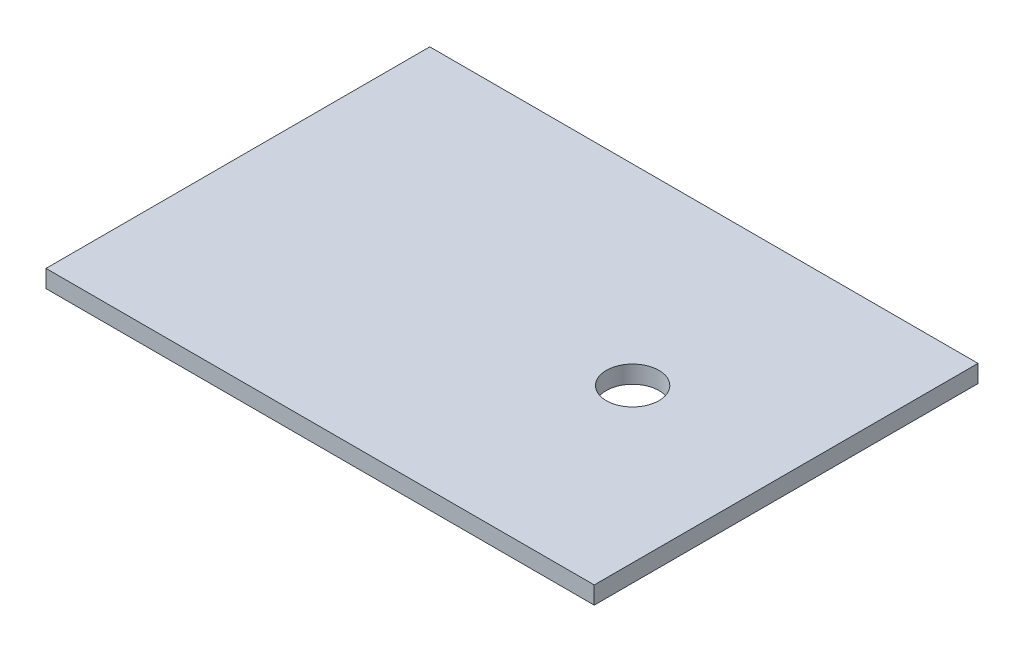
ISO-10303-21;
HEADER;
FILE_DESCRIPTION(('STEP AP214'),'2;1');
FILE_NAME('part.step','',(''),(''),'','','');
FILE_SCHEMA(('AUTOMOTIVE_DESIGN { 1 0 10303 214 1 1 1 1 }'));
ENDSEC;
DATA;
#1=APPLICATION_CONTEXT('core data for automotive mechanical design processes');
#2=APPLICATION_PROTOCOL_DEFINITION('international standard','automotive_design',2000,#1);
#3=PRODUCT_CONTEXT('',#1,'mechanical');
#4=PRODUCT('Part','Part','',(#3));
#5=PRODUCT_RELATED_PRODUCT_CATEGORY('part','',(#4));
#6=PRODUCT_DEFINITION_FORMATION('','',#4);
#7=PRODUCT_DEFINITION_CONTEXT('part definition',#1,'design');
#8=PRODUCT_DEFINITION('design','',#6,#7);
#9=PRODUCT_DEFINITION_SHAPE('','',#8);
#10=(LENGTH_UNIT() NAMED_UNIT(*) SI_UNIT(.MILLI.,.METRE.));
#11=(NAMED_UNIT(*) PLANE_ANGLE_UNIT() SI_UNIT($,.RADIAN.));
#12=(NAMED_UNIT(*) SI_UNIT($,.STERADIAN.) SOLID_ANGLE_UNIT());
#13=UNCERTAINTY_MEASURE_WITH_UNIT(LENGTH_MEASURE(1.E-05),#10,'distance_accuracy_value','');
#14=(GEOMETRIC_REPRESENTATION_CONTEXT(3) GLOBAL_UNCERTAINTY_ASSIGNED_CONTEXT((#13)) GLOBAL_UNIT_ASSIGNED_CONTEXT((#10,
#11,#12)) REPRESENTATION_CONTEXT('',''));
#15=CARTESIAN_POINT('',(0.,0.,0.));
#16=DIRECTION('',(0.,0.,1.));
#17=DIRECTION('',(1.,0.,0.));
#18=AXIS2_PLACEMENT_3D('',#15,#16,#17);
#19=CARTESIAN_POINT('',(0.,8.,0.));
#20=DIRECTION('',(0.,-1.,0.));
#21=DIRECTION('',(0.,0.,-1.));
#22=AXIS2_PLACEMENT_3D('',#19,#20,#21);
#23=PLANE('',#22);
#24=DIRECTION('',(0.,0.,1.));
#25=VECTOR('',#24,1.);
#26=CARTESIAN_POINT('',(-125.,8.,87.5));
#27=LINE('',#26,#25);
#28=CARTESIAN_POINT('',(-125.,8.,-87.5));
#29=VERTEX_POINT('',#28);
#30=CARTESIAN_POINT('',(-125.,8.,87.5));
#31=VERTEX_POINT('',#30);
#32=EDGE_CURVE('E85',#29,#31,#27,.T.);
#33=ORIENTED_EDGE('',*,*,#32,.T.);
#34=DIRECTION('',(1.,0.,0.));
#35=VECTOR('',#34,1.);
#36=CARTESIAN_POINT('',(-125.,8.,87.5));
#37=LINE('',#36,#35);
#38=CARTESIAN_POINT('',(125.,8.,87.5));
#39=VERTEX_POINT('',#38);
#40=EDGE_CURVE('E80',#31,#39,#37,.T.);
#41=ORIENTED_EDGE('',*,*,#40,.T.);
#42=DIRECTION('',(0.,0.,-1.));
#43=VECTOR('',#42,1.);
#44=CARTESIAN_POINT('',(125.,8.,87.5));
#45=LINE('',#44,#43);
#46=CARTESIAN_POINT('',(125.,8.,-87.5));
#47=VERTEX_POINT('',#46);
#48=EDGE_CURVE('E83',#39,#47,#45,.T.);
#49=ORIENTED_EDGE('',*,*,#48,.T.);
#50=DIRECTION('',(-1.,0.,0.));
#51=VECTOR('',#50,1.);
#52=CARTESIAN_POINT('',(-125.,8.,-87.5));
#53=LINE('',#52,#51);
#54=EDGE_CURVE('E50',#47,#29,#53,.T.);
#55=ORIENTED_EDGE('',*,*,#54,.T.);
#56=EDGE_LOOP('',(#33,#41,#49,#55));
#57=FACE_BOUND('',#56,.T.);
#58=CARTESIAN_POINT('',(55.,8.,0.));
#59=DIRECTION('',(0.,1.,0.));
#60=DIRECTION('',(0.,0.,1.));
#61=AXIS2_PLACEMENT_3D('',#58,#59,#60);
#62=CIRCLE('',#61,12.);
#63=CARTESIAN_POINT('',(55.,8.,12.));
#64=VERTEX_POINT('',#63);
#65=EDGE_CURVE('E100',#64,#64,#62,.T.);
#66=ORIENTED_EDGE('',*,*,#65,.F.);
#67=EDGE_LOOP('',(#66));
#68=FACE_BOUND('',#67,.T.);
#69=ADVANCED_FACE('F33',(#57,#68),#23,.F.);
#70=CARTESIAN_POINT('',(0.,0.,0.));
#71=DIRECTION('',(0.,-1.,0.));
#72=DIRECTION('',(0.,0.,-1.));
#73=AXIS2_PLACEMENT_3D('',#70,#71,#72);
#74=PLANE('',#73);
#75=DIRECTION('',(0.,0.,1.));
#76=VECTOR('',#75,1.);
#77=CARTESIAN_POINT('',(-125.,0.,87.5));
#78=LINE('',#77,#76);
#79=CARTESIAN_POINT('',(-125.,0.,-87.5));
#80=VERTEX_POINT('',#79);
#81=CARTESIAN_POINT('',(-125.,0.,87.5));
#82=VERTEX_POINT('',#81);
#83=EDGE_CURVE('E97',#80,#82,#78,.T.);
#84=ORIENTED_EDGE('',*,*,#83,.F.);
#85=DIRECTION('',(-1.,0.,0.));
#86=VECTOR('',#85,1.);
#87=CARTESIAN_POINT('',(-125.,0.,-87.5));
#88=LINE('',#87,#86);
#89=CARTESIAN_POINT('',(125.,0.,-87.5));
#90=VERTEX_POINT('',#89);
#91=EDGE_CURVE('E73',#90,#80,#88,.T.);
#92=ORIENTED_EDGE('',*,*,#91,.F.);
#93=DIRECTION('',(0.,0.,-1.));
#94=VECTOR('',#93,1.);
#95=CARTESIAN_POINT('',(125.,0.,87.5));
#96=LINE('',#95,#94);
#97=CARTESIAN_POINT('',(125.,0.,87.5));
#98=VERTEX_POINT('',#97);
#99=EDGE_CURVE('E67',#98,#90,#96,.T.);
#100=ORIENTED_EDGE('',*,*,#99,.F.);
#101=DIRECTION('',(1.,0.,0.));
#102=VECTOR('',#101,1.);
#103=CARTESIAN_POINT('',(-125.,0.,87.5));
#104=LINE('',#103,#102);
#105=EDGE_CURVE('E89',#82,#98,#104,.T.);
#106=ORIENTED_EDGE('',*,*,#105,.F.);
#107=EDGE_LOOP('',(#84,#92,#100,#106));
#108=FACE_BOUND('',#107,.T.);
#109=CARTESIAN_POINT('',(55.,0.,0.));
#110=DIRECTION('',(0.,1.,0.));
#111=DIRECTION('',(0.,0.,1.));
#112=AXIS2_PLACEMENT_3D('',#109,#110,#111);
#113=CIRCLE('',#112,12.);
#114=CARTESIAN_POINT('',(55.,0.,12.));
#115=VERTEX_POINT('',#114);
#116=EDGE_CURVE('E112',#115,#115,#113,.T.);
#117=ORIENTED_EDGE('',*,*,#116,.T.);
#118=EDGE_LOOP('',(#117));
#119=FACE_BOUND('',#118,.T.);
#120=ADVANCED_FACE('F108',(#108,#119),#74,.T.);
#121=CARTESIAN_POINT('',(-125.,8.,87.5));
#122=DIRECTION('',(1.,0.,0.));
#123=DIRECTION('',(0.,0.,-1.));
#124=AXIS2_PLACEMENT_3D('',#121,#122,#123);
#125=PLANE('',#124);
#126=ORIENTED_EDGE('',*,*,#83,.T.);
#127=DIRECTION('',(0.,-1.,0.));
#128=VECTOR('',#127,1.);
#129=CARTESIAN_POINT('',(-125.,8.,87.5));
#130=LINE('',#129,#128);
#131=EDGE_CURVE('E11',#31,#82,#130,.T.);
#132=ORIENTED_EDGE('',*,*,#131,.F.);
#133=ORIENTED_EDGE('',*,*,#32,.F.);
#134=DIRECTION('',(0.,-1.,0.));
#135=VECTOR('',#134,1.);
#136=CARTESIAN_POINT('',(-125.,8.,-87.5));
#137=LINE('',#136,#135);
#138=EDGE_CURVE('E93',#29,#80,#137,.T.);
#139=ORIENTED_EDGE('',*,*,#138,.T.);
#140=EDGE_LOOP('',(#126,#132,#133,#139));
#141=FACE_BOUND('',#140,.T.);
#142=ADVANCED_FACE('F35',(#141),#125,.F.);
#143=CARTESIAN_POINT('',(-125.,8.,87.5));
#144=DIRECTION('',(0.,0.,-1.));
#145=DIRECTION('',(-1.,0.,0.));
#146=AXIS2_PLACEMENT_3D('',#143,#144,#145);
#147=PLANE('',#146);
#148=ORIENTED_EDGE('',*,*,#105,.T.);
#149=DIRECTION('',(0.,-1.,0.));
#150=VECTOR('',#149,1.);
#151=CARTESIAN_POINT('',(125.,8.,87.5));
#152=LINE('',#151,#150);
#153=EDGE_CURVE('E42',#39,#98,#152,.T.);
#154=ORIENTED_EDGE('',*,*,#153,.F.);
#155=ORIENTED_EDGE('',*,*,#40,.F.);
#156=ORIENTED_EDGE('',*,*,#131,.T.);
#157=EDGE_LOOP('',(#148,#154,#155,#156));
#158=FACE_BOUND('',#157,.T.);
#159=ADVANCED_FACE('F88',(#158),#147,.F.);
#160=CARTESIAN_POINT('',(125.,8.,87.5));
#161=DIRECTION('',(-1.,0.,0.));
#162=DIRECTION('',(0.,0.,1.));
#163=AXIS2_PLACEMENT_3D('',#160,#161,#162);
#164=PLANE('',#163);
#165=ORIENTED_EDGE('',*,*,#99,.T.);
#166=DIRECTION('',(0.,-1.,0.));
#167=VECTOR('',#166,1.);
#168=CARTESIAN_POINT('',(125.,8.,-87.5));
#169=LINE('',#168,#167);
#170=EDGE_CURVE('E90',#47,#90,#169,.T.);
#171=ORIENTED_EDGE('',*,*,#170,.F.);
#172=ORIENTED_EDGE('',*,*,#48,.F.);
#173=ORIENTED_EDGE('',*,*,#153,.T.);
#174=EDGE_LOOP('',(#165,#171,#172,#173));
#175=FACE_BOUND('',#174,.T.);
#176=ADVANCED_FACE('F91',(#175),#164,.F.);
#177=CARTESIAN_POINT('',(-125.,8.,-87.5));
#178=DIRECTION('',(0.,0.,1.));
#179=DIRECTION('',(1.,0.,0.));
#180=AXIS2_PLACEMENT_3D('',#177,#178,#179);
#181=PLANE('',#180);
#182=ORIENTED_EDGE('',*,*,#91,.T.);
#183=ORIENTED_EDGE('',*,*,#138,.F.);
#184=ORIENTED_EDGE('',*,*,#54,.F.);
#185=ORIENTED_EDGE('',*,*,#170,.T.);
#186=EDGE_LOOP('',(#182,#183,#184,#185));
#187=FACE_BOUND('',#186,.T.);
#188=ADVANCED_FACE('F105',(#187),#181,.F.);
#189=CARTESIAN_POINT('',(55.,8.,0.));
#190=DIRECTION('',(0.,-1.,0.));
#191=DIRECTION('',(0.,0.,-1.));
#192=AXIS2_PLACEMENT_3D('',#189,#190,#191);
#193=CYLINDRICAL_SURFACE('',#192,12.);
#194=ORIENTED_EDGE('',*,*,#65,.T.);
#195=EDGE_LOOP('',(#194));
#196=FACE_BOUND('',#195,.T.);
#197=ORIENTED_EDGE('',*,*,#116,.F.);
#198=EDGE_LOOP('',(#197));
#199=FACE_BOUND('',#198,.T.);
#200=ADVANCED_FACE('F118',(#196,#199),#193,.F.);
#201=CLOSED_SHELL('',(#69,#120,#142,#159,#176,#188,#200));
#202=MANIFOLD_SOLID_BREP('B2',#201);
#203=ADVANCED_BREP_SHAPE_REPRESENTATION('',(#18,#202),#14);
#204=SHAPE_DEFINITION_REPRESENTATION(#9,#203);
ENDSEC;
END-ISO-10303-21;
